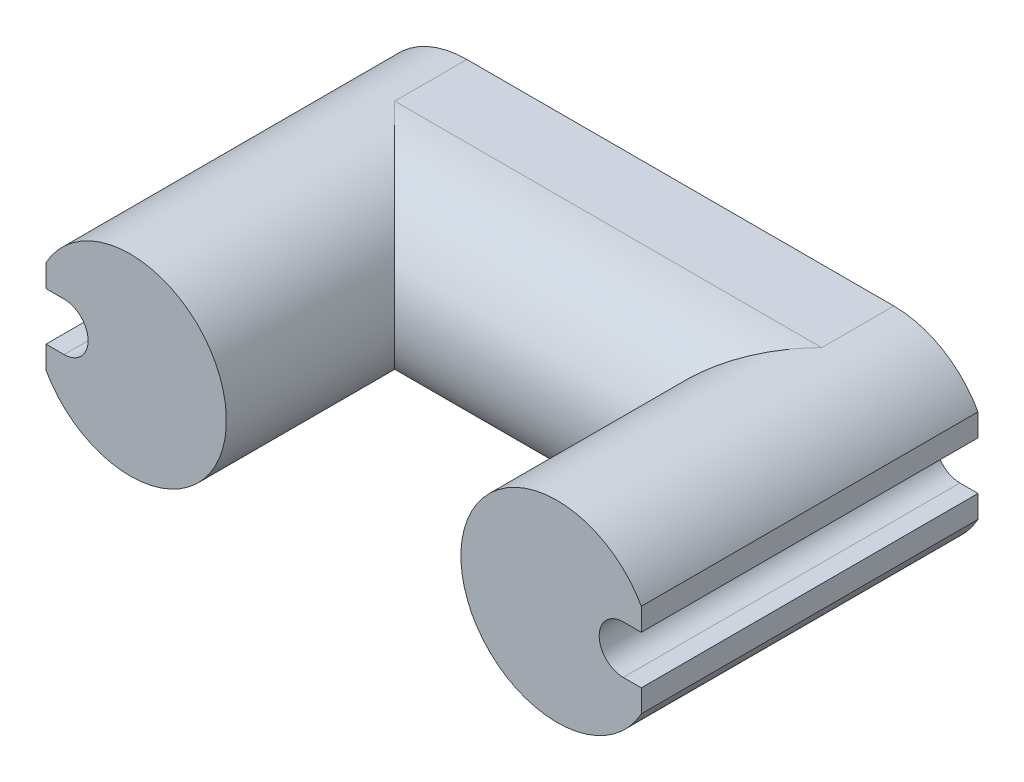
ISO-10303-21;
HEADER;
FILE_DESCRIPTION(('STEP AP214'),'2;1');
FILE_NAME('part.step','',(''),(''),'','','');
FILE_SCHEMA(('AUTOMOTIVE_DESIGN { 1 0 10303 214 1 1 1 1 }'));
ENDSEC;
DATA;
#1=APPLICATION_CONTEXT('core data for automotive mechanical design processes');
#2=APPLICATION_PROTOCOL_DEFINITION('international standard','automotive_design',2000,#1);
#3=PRODUCT_CONTEXT('',#1,'mechanical');
#4=PRODUCT('Part','Part','',(#3));
#5=PRODUCT_RELATED_PRODUCT_CATEGORY('part','',(#4));
#6=PRODUCT_DEFINITION_FORMATION('','',#4);
#7=PRODUCT_DEFINITION_CONTEXT('part definition',#1,'design');
#8=PRODUCT_DEFINITION('design','',#6,#7);
#9=PRODUCT_DEFINITION_SHAPE('','',#8);
#10=(LENGTH_UNIT() NAMED_UNIT(*) SI_UNIT(.MILLI.,.METRE.));
#11=(NAMED_UNIT(*) PLANE_ANGLE_UNIT() SI_UNIT($,.RADIAN.));
#12=(NAMED_UNIT(*) SI_UNIT($,.STERADIAN.) SOLID_ANGLE_UNIT());
#13=UNCERTAINTY_MEASURE_WITH_UNIT(LENGTH_MEASURE(1.E-05),#10,'distance_accuracy_value','');
#14=(GEOMETRIC_REPRESENTATION_CONTEXT(3) GLOBAL_UNCERTAINTY_ASSIGNED_CONTEXT((#13)) GLOBAL_UNIT_ASSIGNED_CONTEXT((#10,
#11,#12)) REPRESENTATION_CONTEXT('',''));
#15=CARTESIAN_POINT('',(0.,0.,0.));
#16=DIRECTION('',(0.,0.,1.));
#17=DIRECTION('',(1.,0.,0.));
#18=AXIS2_PLACEMENT_3D('',#15,#16,#17);
#19=CARTESIAN_POINT('',(-17.75,0.,-28.));
#20=DIRECTION('',(0.,0.,1.));
#21=DIRECTION('',(1.,0.,0.));
#22=AXIS2_PLACEMENT_3D('',#19,#20,#21);
#23=CYLINDRICAL_SURFACE('',#22,8.);
#24=CARTESIAN_POINT('',(-17.75,0.,-22.));
#25=DIRECTION('',(0.707106781186547,0.,-0.707106781186547));
#26=DIRECTION('',(0.707106781186547,0.,0.707106781186547));
#27=AXIS2_PLACEMENT_3D('',#24,#25,#26);
#28=ELLIPSE('',#27,11.3137084989848,8.);
#29=CARTESIAN_POINT('',(-17.75,-8.,-22.));
#30=VERTEX_POINT('',#29);
#31=CARTESIAN_POINT('',(-17.75,8.,-22.));
#32=VERTEX_POINT('',#31);
#33=EDGE_CURVE('E50',#30,#32,#28,.F.);
#34=ORIENTED_EDGE('',*,*,#33,.T.);
#35=DIRECTION('',(0.,0.,1.));
#36=VECTOR('',#35,1.);
#37=CARTESIAN_POINT('',(-17.75,8.,-28.));
#38=LINE('',#37,#36);
#39=CARTESIAN_POINT('',(-17.75,8.00000000000001,-28.));
#40=VERTEX_POINT('',#39);
#41=EDGE_CURVE('E209',#40,#32,#38,.T.);
#42=ORIENTED_EDGE('',*,*,#41,.F.);
#43=CARTESIAN_POINT('',(-17.75,0.,-28.));
#44=DIRECTION('',(0.,0.,1.));
#45=DIRECTION('',(1.,0.,0.));
#46=AXIS2_PLACEMENT_3D('',#43,#44,#45);
#47=CIRCLE('',#46,8.);
#48=CARTESIAN_POINT('',(-24.75,3.87298334620742,-28.));
#49=VERTEX_POINT('',#48);
#50=EDGE_CURVE('E241',#40,#49,#47,.T.);
#51=ORIENTED_EDGE('',*,*,#50,.T.);
#52=DIRECTION('',(0.,0.,1.));
#53=VECTOR('',#52,1.);
#54=CARTESIAN_POINT('',(-24.75,3.87298334620742,-28.));
#55=LINE('',#54,#53);
#56=CARTESIAN_POINT('',(-24.75,3.87298334620742,0.));
#57=VERTEX_POINT('',#56);
#58=EDGE_CURVE('E267',#49,#57,#55,.T.);
#59=ORIENTED_EDGE('',*,*,#58,.T.);
#60=CARTESIAN_POINT('',(-17.75,0.,0.));
#61=DIRECTION('',(0.,0.,1.));
#62=DIRECTION('',(1.,0.,0.));
#63=AXIS2_PLACEMENT_3D('',#60,#61,#62);
#64=CIRCLE('',#63,8.);
#65=CARTESIAN_POINT('',(-24.75,-3.87298334620742,0.));
#66=VERTEX_POINT('',#65);
#67=EDGE_CURVE('E258',#66,#57,#64,.T.);
#68=ORIENTED_EDGE('',*,*,#67,.F.);
#69=DIRECTION('',(0.,0.,1.));
#70=VECTOR('',#69,1.);
#71=CARTESIAN_POINT('',(-24.75,-3.87298334620742,-28.));
#72=LINE('',#71,#70);
#73=CARTESIAN_POINT('',(-24.75,-3.87298334620742,-28.));
#74=VERTEX_POINT('',#73);
#75=EDGE_CURVE('E269',#74,#66,#72,.T.);
#76=ORIENTED_EDGE('',*,*,#75,.F.);
#77=CARTESIAN_POINT('',(-17.75,-8.,-28.));
#78=VERTEX_POINT('',#77);
#79=EDGE_CURVE('E242',#74,#78,#47,.T.);
#80=ORIENTED_EDGE('',*,*,#79,.T.);
#81=DIRECTION('',(0.,0.,1.));
#82=VECTOR('',#81,1.);
#83=CARTESIAN_POINT('',(-17.75,-8.,-28.));
#84=LINE('',#83,#82);
#85=EDGE_CURVE('E55',#78,#30,#84,.T.);
#86=ORIENTED_EDGE('',*,*,#85,.T.);
#87=EDGE_LOOP('',(#34,#42,#51,#59,#68,#76,#80,#86));
#88=FACE_BOUND('',#87,.T.);
#89=ADVANCED_FACE('F33',(#88),#23,.T.);
#90=CARTESIAN_POINT('',(-23.25,0.,-28.));
#91=DIRECTION('',(0.,0.,1.));
#92=DIRECTION('',(1.,0.,0.));
#93=AXIS2_PLACEMENT_3D('',#90,#91,#92);
#94=CYLINDRICAL_SURFACE('',#93,2.);
#95=CARTESIAN_POINT('',(-23.25,0.,0.));
#96=DIRECTION('',(0.,0.,-1.));
#97=DIRECTION('',(1.,0.,0.));
#98=AXIS2_PLACEMENT_3D('',#95,#96,#97);
#99=CIRCLE('',#98,2.);
#100=CARTESIAN_POINT('',(-23.25,2.,0.));
#101=VERTEX_POINT('',#100);
#102=CARTESIAN_POINT('',(-23.25,-2.,0.));
#103=VERTEX_POINT('',#102);
#104=EDGE_CURVE('E228',#101,#103,#99,.T.);
#105=ORIENTED_EDGE('',*,*,#104,.F.);
#106=DIRECTION('',(0.,0.,1.));
#107=VECTOR('',#106,1.);
#108=CARTESIAN_POINT('',(-23.25,2.,-28.));
#109=LINE('',#108,#107);
#110=CARTESIAN_POINT('',(-23.25,2.,-28.));
#111=VERTEX_POINT('',#110);
#112=EDGE_CURVE('E11',#111,#101,#109,.T.);
#113=ORIENTED_EDGE('',*,*,#112,.F.);
#114=CARTESIAN_POINT('',(-23.25,0.,-28.));
#115=DIRECTION('',(0.,0.,-1.));
#116=DIRECTION('',(1.,0.,0.));
#117=AXIS2_PLACEMENT_3D('',#114,#115,#116);
#118=CIRCLE('',#117,2.);
#119=CARTESIAN_POINT('',(-23.25,-2.,-28.));
#120=VERTEX_POINT('',#119);
#121=EDGE_CURVE('E231',#111,#120,#118,.T.);
#122=ORIENTED_EDGE('',*,*,#121,.T.);
#123=DIRECTION('',(0.,0.,1.));
#124=VECTOR('',#123,1.);
#125=CARTESIAN_POINT('',(-23.25,-2.,-28.));
#126=LINE('',#125,#124);
#127=EDGE_CURVE('E37',#120,#103,#126,.T.);
#128=ORIENTED_EDGE('',*,*,#127,.T.);
#129=EDGE_LOOP('',(#105,#113,#122,#128));
#130=FACE_BOUND('',#129,.T.);
#131=ADVANCED_FACE('F35',(#130),#94,.F.);
#132=CARTESIAN_POINT('',(-23.25,2.,-28.));
#133=DIRECTION('',(0.,-1.,0.));
#134=DIRECTION('',(0.,0.,-1.));
#135=AXIS2_PLACEMENT_3D('',#132,#133,#134);
#136=PLANE('',#135);
#137=DIRECTION('',(1.,0.,0.));
#138=VECTOR('',#137,1.);
#139=CARTESIAN_POINT('',(-23.25,2.,0.));
#140=LINE('',#139,#138);
#141=CARTESIAN_POINT('',(-24.75,2.,0.));
#142=VERTEX_POINT('',#141);
#143=EDGE_CURVE('E235',#142,#101,#140,.T.);
#144=ORIENTED_EDGE('',*,*,#143,.F.);
#145=DIRECTION('',(0.,0.,1.));
#146=VECTOR('',#145,1.);
#147=CARTESIAN_POINT('',(-24.75,2.,-28.));
#148=LINE('',#147,#146);
#149=CARTESIAN_POINT('',(-24.75,2.,-28.));
#150=VERTEX_POINT('',#149);
#151=EDGE_CURVE('E42',#150,#142,#148,.T.);
#152=ORIENTED_EDGE('',*,*,#151,.F.);
#153=DIRECTION('',(1.,0.,0.));
#154=VECTOR('',#153,1.);
#155=CARTESIAN_POINT('',(-23.25,2.,-28.));
#156=LINE('',#155,#154);
#157=EDGE_CURVE('E247',#150,#111,#156,.T.);
#158=ORIENTED_EDGE('',*,*,#157,.T.);
#159=ORIENTED_EDGE('',*,*,#112,.T.);
#160=EDGE_LOOP('',(#144,#152,#158,#159));
#161=FACE_BOUND('',#160,.T.);
#162=ADVANCED_FACE('F283',(#161),#136,.T.);
#163=CARTESIAN_POINT('',(-24.75,2.,-28.));
#164=DIRECTION('',(-1.,0.,0.));
#165=DIRECTION('',(0.,-1.,0.));
#166=AXIS2_PLACEMENT_3D('',#163,#164,#165);
#167=PLANE('',#166);
#168=DIRECTION('',(0.,-1.,0.));
#169=VECTOR('',#168,1.);
#170=CARTESIAN_POINT('',(-24.75,2.,0.));
#171=LINE('',#170,#169);
#172=EDGE_CURVE('E261',#57,#142,#171,.T.);
#173=ORIENTED_EDGE('',*,*,#172,.F.);
#174=ORIENTED_EDGE('',*,*,#58,.F.);
#175=DIRECTION('',(0.,-1.,0.));
#176=VECTOR('',#175,1.);
#177=CARTESIAN_POINT('',(-24.75,2.,-28.));
#178=LINE('',#177,#176);
#179=EDGE_CURVE('E244',#49,#150,#178,.T.);
#180=ORIENTED_EDGE('',*,*,#179,.T.);
#181=ORIENTED_EDGE('',*,*,#151,.T.);
#182=EDGE_LOOP('',(#173,#174,#180,#181));
#183=FACE_BOUND('',#182,.T.);
#184=ADVANCED_FACE('F294',(#183),#167,.T.);
#185=CARTESIAN_POINT('',(-24.75,-3.87298334620742,-28.));
#186=DIRECTION('',(-1.,0.,0.));
#187=DIRECTION('',(0.,-1.,0.));
#188=AXIS2_PLACEMENT_3D('',#185,#186,#187);
#189=PLANE('',#188);
#190=DIRECTION('',(0.,-1.,0.));
#191=VECTOR('',#190,1.);
#192=CARTESIAN_POINT('',(-24.75,-3.87298334620742,0.));
#193=LINE('',#192,#191);
#194=CARTESIAN_POINT('',(-24.75,-2.,0.));
#195=VERTEX_POINT('',#194);
#196=EDGE_CURVE('E255',#195,#66,#193,.T.);
#197=ORIENTED_EDGE('',*,*,#196,.F.);
#198=DIRECTION('',(0.,0.,1.));
#199=VECTOR('',#198,1.);
#200=CARTESIAN_POINT('',(-24.75,-2.,-28.));
#201=LINE('',#200,#199);
#202=CARTESIAN_POINT('',(-24.75,-2.,-28.));
#203=VERTEX_POINT('',#202);
#204=EDGE_CURVE('E270',#203,#195,#201,.T.);
#205=ORIENTED_EDGE('',*,*,#204,.F.);
#206=DIRECTION('',(0.,-1.,0.));
#207=VECTOR('',#206,1.);
#208=CARTESIAN_POINT('',(-24.75,-3.87298334620742,-28.));
#209=LINE('',#208,#207);
#210=EDGE_CURVE('E238',#203,#74,#209,.T.);
#211=ORIENTED_EDGE('',*,*,#210,.T.);
#212=ORIENTED_EDGE('',*,*,#75,.T.);
#213=EDGE_LOOP('',(#197,#205,#211,#212));
#214=FACE_BOUND('',#213,.T.);
#215=ADVANCED_FACE('F290',(#214),#189,.T.);
#216=CARTESIAN_POINT('',(-23.25,-2.,-28.));
#217=DIRECTION('',(0.,1.,0.));
#218=DIRECTION('',(0.,0.,1.));
#219=AXIS2_PLACEMENT_3D('',#216,#217,#218);
#220=PLANE('',#219);
#221=DIRECTION('',(-1.,0.,0.));
#222=VECTOR('',#221,1.);
#223=CARTESIAN_POINT('',(-23.25,-2.,0.));
#224=LINE('',#223,#222);
#225=EDGE_CURVE('E252',#103,#195,#224,.T.);
#226=ORIENTED_EDGE('',*,*,#225,.F.);
#227=ORIENTED_EDGE('',*,*,#127,.F.);
#228=DIRECTION('',(-1.,0.,0.));
#229=VECTOR('',#228,1.);
#230=CARTESIAN_POINT('',(-23.25,-2.,-28.));
#231=LINE('',#230,#229);
#232=EDGE_CURVE('E234',#120,#203,#231,.T.);
#233=ORIENTED_EDGE('',*,*,#232,.T.);
#234=ORIENTED_EDGE('',*,*,#204,.T.);
#235=EDGE_LOOP('',(#226,#227,#233,#234));
#236=FACE_BOUND('',#235,.T.);
#237=ADVANCED_FACE('F277',(#236),#220,.T.);
#238=CARTESIAN_POINT('',(-23.25,0.,-28.));
#239=DIRECTION('',(0.,0.,1.));
#240=DIRECTION('',(1.,0.,0.));
#241=AXIS2_PLACEMENT_3D('',#238,#239,#240);
#242=PLANE('',#241);
#243=ORIENTED_EDGE('',*,*,#121,.F.);
#244=ORIENTED_EDGE('',*,*,#157,.F.);
#245=ORIENTED_EDGE('',*,*,#179,.F.);
#246=ORIENTED_EDGE('',*,*,#50,.F.);
#247=DIRECTION('',(1.,0.,0.));
#248=VECTOR('',#247,1.);
#249=CARTESIAN_POINT('',(-24.751,8.00000000000001,-28.));
#250=LINE('',#249,#248);
#251=CARTESIAN_POINT('',(17.75,8.00000000000001,-28.));
#252=VERTEX_POINT('',#251);
#253=EDGE_CURVE('E218',#40,#252,#250,.T.);
#254=ORIENTED_EDGE('',*,*,#253,.T.);
#255=CARTESIAN_POINT('',(17.75,0.,-28.));
#256=DIRECTION('',(0.,0.,1.));
#257=DIRECTION('',(-1.,0.,0.));
#258=AXIS2_PLACEMENT_3D('',#255,#256,#257);
#259=CIRCLE('',#258,8.);
#260=CARTESIAN_POINT('',(24.75,3.87298334620743,-28.));
#261=VERTEX_POINT('',#260);
#262=EDGE_CURVE('E181',#261,#252,#259,.T.);
#263=ORIENTED_EDGE('',*,*,#262,.F.);
#264=DIRECTION('',(0.,1.,0.));
#265=VECTOR('',#264,1.);
#266=CARTESIAN_POINT('',(24.75,2.00000000000001,-28.));
#267=LINE('',#266,#265);
#268=CARTESIAN_POINT('',(24.75,2.00000000000001,-28.));
#269=VERTEX_POINT('',#268);
#270=EDGE_CURVE('E169',#269,#261,#267,.T.);
#271=ORIENTED_EDGE('',*,*,#270,.F.);
#272=DIRECTION('',(1.,0.,0.));
#273=VECTOR('',#272,1.);
#274=CARTESIAN_POINT('',(23.25,2.00000000000001,-28.));
#275=LINE('',#274,#273);
#276=CARTESIAN_POINT('',(23.25,2.00000000000001,-28.));
#277=VERTEX_POINT('',#276);
#278=EDGE_CURVE('E149',#277,#269,#275,.T.);
#279=ORIENTED_EDGE('',*,*,#278,.F.);
#280=CARTESIAN_POINT('',(23.25,0.,-28.));
#281=DIRECTION('',(0.,0.,-1.));
#282=DIRECTION('',(-1.,0.,0.));
#283=AXIS2_PLACEMENT_3D('',#280,#281,#282);
#284=CIRCLE('',#283,2.00000000000001);
#285=CARTESIAN_POINT('',(23.25,-2.00000000000001,-28.));
#286=VERTEX_POINT('',#285);
#287=EDGE_CURVE('E165',#286,#277,#284,.T.);
#288=ORIENTED_EDGE('',*,*,#287,.F.);
#289=DIRECTION('',(-1.,0.,0.));
#290=VECTOR('',#289,1.);
#291=CARTESIAN_POINT('',(23.25,-2.00000000000001,-28.));
#292=LINE('',#291,#290);
#293=CARTESIAN_POINT('',(24.75,-2.00000000000001,-28.));
#294=VERTEX_POINT('',#293);
#295=EDGE_CURVE('E157',#294,#286,#292,.T.);
#296=ORIENTED_EDGE('',*,*,#295,.F.);
#297=DIRECTION('',(0.,1.,0.));
#298=VECTOR('',#297,1.);
#299=CARTESIAN_POINT('',(24.75,-3.87298334620742,-28.));
#300=LINE('',#299,#298);
#301=CARTESIAN_POINT('',(24.75,-3.87298334620742,-28.));
#302=VERTEX_POINT('',#301);
#303=EDGE_CURVE('E183',#302,#294,#300,.T.);
#304=ORIENTED_EDGE('',*,*,#303,.F.);
#305=CARTESIAN_POINT('',(17.75,-8.,-28.));
#306=VERTEX_POINT('',#305);
#307=EDGE_CURVE('E180',#306,#302,#259,.T.);
#308=ORIENTED_EDGE('',*,*,#307,.F.);
#309=DIRECTION('',(1.,0.,0.));
#310=VECTOR('',#309,1.);
#311=CARTESIAN_POINT('',(-24.751,-8.,-28.));
#312=LINE('',#311,#310);
#313=EDGE_CURVE('E224',#78,#306,#312,.T.);
#314=ORIENTED_EDGE('',*,*,#313,.F.);
#315=ORIENTED_EDGE('',*,*,#79,.F.);
#316=ORIENTED_EDGE('',*,*,#210,.F.);
#317=ORIENTED_EDGE('',*,*,#232,.F.);
#318=EDGE_LOOP('',(#243,#244,#245,#246,#254,#263,#271,#279,#288,#296,#304,#308,#314,#315,#316,#317));
#319=FACE_BOUND('',#318,.T.);
#320=ADVANCED_FACE('F163',(#319),#242,.F.);
#321=CARTESIAN_POINT('',(-23.25,0.,0.));
#322=DIRECTION('',(0.,0.,1.));
#323=DIRECTION('',(1.,0.,0.));
#324=AXIS2_PLACEMENT_3D('',#321,#322,#323);
#325=PLANE('',#324);
#326=ORIENTED_EDGE('',*,*,#104,.T.);
#327=ORIENTED_EDGE('',*,*,#225,.T.);
#328=ORIENTED_EDGE('',*,*,#196,.T.);
#329=ORIENTED_EDGE('',*,*,#67,.T.);
#330=ORIENTED_EDGE('',*,*,#172,.T.);
#331=ORIENTED_EDGE('',*,*,#143,.T.);
#332=EDGE_LOOP('',(#326,#327,#328,#329,#330,#331));
#333=FACE_BOUND('',#332,.T.);
#334=ADVANCED_FACE('F279',(#333),#325,.T.);
#335=CARTESIAN_POINT('',(-24.751,8.00000000000001,-28.));
#336=DIRECTION('',(0.,1.,0.));
#337=DIRECTION('',(0.,0.,1.));
#338=AXIS2_PLACEMENT_3D('',#335,#336,#337);
#339=PLANE('',#338);
#340=ORIENTED_EDGE('',*,*,#253,.F.);
#341=ORIENTED_EDGE('',*,*,#41,.T.);
#342=DIRECTION('',(1.,0.,0.));
#343=VECTOR('',#342,1.);
#344=CARTESIAN_POINT('',(-24.751,8.,-22.));
#345=LINE('',#344,#343);
#346=CARTESIAN_POINT('',(17.75,8.,-22.));
#347=VERTEX_POINT('',#346);
#348=EDGE_CURVE('E215',#32,#347,#345,.T.);
#349=ORIENTED_EDGE('',*,*,#348,.T.);
#350=DIRECTION('',(0.,0.,1.));
#351=VECTOR('',#350,1.);
#352=CARTESIAN_POINT('',(17.75,8.00000000000001,-28.));
#353=LINE('',#352,#351);
#354=EDGE_CURVE('E207',#252,#347,#353,.T.);
#355=ORIENTED_EDGE('',*,*,#354,.F.);
#356=EDGE_LOOP('',(#340,#341,#349,#355));
#357=FACE_BOUND('',#356,.T.);
#358=ADVANCED_FACE('F299',(#357),#339,.T.);
#359=CARTESIAN_POINT('',(-24.751,0.,-22.));
#360=DIRECTION('',(1.,0.,0.));
#361=DIRECTION('',(0.,0.,-1.));
#362=AXIS2_PLACEMENT_3D('',#359,#360,#361);
#363=CYLINDRICAL_SURFACE('',#362,8.);
#364=ORIENTED_EDGE('',*,*,#33,.F.);
#365=DIRECTION('',(1.,0.,0.));
#366=VECTOR('',#365,1.);
#367=CARTESIAN_POINT('',(-24.751,-8.,-22.0000000000001));
#368=LINE('',#367,#366);
#369=CARTESIAN_POINT('',(17.75,-8.,-22.));
#370=VERTEX_POINT('',#369);
#371=EDGE_CURVE('E221',#30,#370,#368,.T.);
#372=ORIENTED_EDGE('',*,*,#371,.T.);
#373=CARTESIAN_POINT('',(17.75,0.,-22.));
#374=DIRECTION('',(-0.707106781186547,0.,-0.707106781186547));
#375=DIRECTION('',(-0.707106781186547,0.,0.707106781186547));
#376=AXIS2_PLACEMENT_3D('',#373,#374,#375);
#377=ELLIPSE('',#376,11.3137084989848,8.);
#378=EDGE_CURVE('E199',#370,#347,#377,.T.);
#379=ORIENTED_EDGE('',*,*,#378,.T.);
#380=ORIENTED_EDGE('',*,*,#348,.F.);
#381=EDGE_LOOP('',(#364,#372,#379,#380));
#382=FACE_BOUND('',#381,.T.);
#383=ADVANCED_FACE('F321',(#382),#363,.T.);
#384=CARTESIAN_POINT('',(-24.751,-8.,-28.));
#385=DIRECTION('',(0.,-1.,0.));
#386=DIRECTION('',(0.,0.,-1.));
#387=AXIS2_PLACEMENT_3D('',#384,#385,#386);
#388=PLANE('',#387);
#389=ORIENTED_EDGE('',*,*,#85,.F.);
#390=ORIENTED_EDGE('',*,*,#313,.T.);
#391=DIRECTION('',(0.,0.,1.));
#392=VECTOR('',#391,1.);
#393=CARTESIAN_POINT('',(17.75,-8.,-28.));
#394=LINE('',#393,#392);
#395=EDGE_CURVE('E210',#306,#370,#394,.T.);
#396=ORIENTED_EDGE('',*,*,#395,.T.);
#397=ORIENTED_EDGE('',*,*,#371,.F.);
#398=EDGE_LOOP('',(#389,#390,#396,#397));
#399=FACE_BOUND('',#398,.T.);
#400=ADVANCED_FACE('F319',(#399),#388,.T.);
#401=CARTESIAN_POINT('',(23.25,0.,-28.));
#402=DIRECTION('',(0.,0.,1.));
#403=DIRECTION('',(1.,0.,0.));
#404=AXIS2_PLACEMENT_3D('',#401,#402,#403);
#405=CYLINDRICAL_SURFACE('',#404,2.00000000000001);
#406=CARTESIAN_POINT('',(23.25,0.,0.));
#407=DIRECTION('',(0.,0.,-1.));
#408=DIRECTION('',(-1.,0.,0.));
#409=AXIS2_PLACEMENT_3D('',#406,#407,#408);
#410=CIRCLE('',#409,2.00000000000001);
#411=CARTESIAN_POINT('',(23.25,-2.00000000000001,0.));
#412=VERTEX_POINT('',#411);
#413=CARTESIAN_POINT('',(23.25,2.00000000000001,0.));
#414=VERTEX_POINT('',#413);
#415=EDGE_CURVE('E187',#412,#414,#410,.T.);
#416=ORIENTED_EDGE('',*,*,#415,.F.);
#417=DIRECTION('',(0.,0.,1.));
#418=VECTOR('',#417,1.);
#419=CARTESIAN_POINT('',(23.25,-2.00000000000001,-28.));
#420=LINE('',#419,#418);
#421=EDGE_CURVE('E172',#286,#412,#420,.T.);
#422=ORIENTED_EDGE('',*,*,#421,.F.);
#423=ORIENTED_EDGE('',*,*,#287,.T.);
#424=DIRECTION('',(0.,0.,1.));
#425=VECTOR('',#424,1.);
#426=CARTESIAN_POINT('',(23.25,2.00000000000001,-28.));
#427=LINE('',#426,#425);
#428=EDGE_CURVE('E146',#277,#414,#427,.T.);
#429=ORIENTED_EDGE('',*,*,#428,.T.);
#430=EDGE_LOOP('',(#416,#422,#423,#429));
#431=FACE_BOUND('',#430,.T.);
#432=ADVANCED_FACE('F171',(#431),#405,.F.);
#433=CARTESIAN_POINT('',(23.25,-2.00000000000001,-28.));
#434=DIRECTION('',(0.,1.,0.));
#435=DIRECTION('',(-1.,0.,0.));
#436=AXIS2_PLACEMENT_3D('',#433,#434,#435);
#437=PLANE('',#436);
#438=DIRECTION('',(-1.,0.,0.));
#439=VECTOR('',#438,1.);
#440=CARTESIAN_POINT('',(23.25,-2.00000000000001,0.));
#441=LINE('',#440,#439);
#442=CARTESIAN_POINT('',(24.75,-2.00000000000001,0.));
#443=VERTEX_POINT('',#442);
#444=EDGE_CURVE('E173',#443,#412,#441,.T.);
#445=ORIENTED_EDGE('',*,*,#444,.F.);
#446=DIRECTION('',(0.,0.,1.));
#447=VECTOR('',#446,1.);
#448=CARTESIAN_POINT('',(24.75,-2.00000000000001,-28.));
#449=LINE('',#448,#447);
#450=EDGE_CURVE('E200',#294,#443,#449,.T.);
#451=ORIENTED_EDGE('',*,*,#450,.F.);
#452=ORIENTED_EDGE('',*,*,#295,.T.);
#453=ORIENTED_EDGE('',*,*,#421,.T.);
#454=EDGE_LOOP('',(#445,#451,#452,#453));
#455=FACE_BOUND('',#454,.T.);
#456=ADVANCED_FACE('F312',(#455),#437,.T.);
#457=CARTESIAN_POINT('',(24.75,-3.87298334620742,-28.));
#458=DIRECTION('',(1.,0.,0.));
#459=DIRECTION('',(0.,1.,0.));
#460=AXIS2_PLACEMENT_3D('',#457,#458,#459);
#461=PLANE('',#460);
#462=DIRECTION('',(0.,1.,0.));
#463=VECTOR('',#462,1.);
#464=CARTESIAN_POINT('',(24.75,-3.87298334620742,0.));
#465=LINE('',#464,#463);
#466=CARTESIAN_POINT('',(24.75,-3.87298334620742,0.));
#467=VERTEX_POINT('',#466);
#468=EDGE_CURVE('E176',#467,#443,#465,.T.);
#469=ORIENTED_EDGE('',*,*,#468,.F.);
#470=DIRECTION('',(0.,0.,1.));
#471=VECTOR('',#470,1.);
#472=CARTESIAN_POINT('',(24.75,-3.87298334620742,-28.));
#473=LINE('',#472,#471);
#474=EDGE_CURVE('E202',#302,#467,#473,.T.);
#475=ORIENTED_EDGE('',*,*,#474,.F.);
#476=ORIENTED_EDGE('',*,*,#303,.T.);
#477=ORIENTED_EDGE('',*,*,#450,.T.);
#478=EDGE_LOOP('',(#469,#475,#476,#477));
#479=FACE_BOUND('',#478,.T.);
#480=ADVANCED_FACE('F316',(#479),#461,.T.);
#481=CARTESIAN_POINT('',(17.75,0.,-28.));
#482=DIRECTION('',(0.,0.,1.));
#483=DIRECTION('',(1.,0.,0.));
#484=AXIS2_PLACEMENT_3D('',#481,#482,#483);
#485=CYLINDRICAL_SURFACE('',#484,8.);
#486=ORIENTED_EDGE('',*,*,#262,.T.);
#487=ORIENTED_EDGE('',*,*,#354,.T.);
#488=ORIENTED_EDGE('',*,*,#378,.F.);
#489=ORIENTED_EDGE('',*,*,#395,.F.);
#490=ORIENTED_EDGE('',*,*,#307,.T.);
#491=ORIENTED_EDGE('',*,*,#474,.T.);
#492=CARTESIAN_POINT('',(17.75,0.,0.));
#493=DIRECTION('',(0.,0.,1.));
#494=DIRECTION('',(-1.,0.,0.));
#495=AXIS2_PLACEMENT_3D('',#492,#493,#494);
#496=CIRCLE('',#495,8.);
#497=CARTESIAN_POINT('',(24.75,3.87298334620743,0.));
#498=VERTEX_POINT('',#497);
#499=EDGE_CURVE('E193',#498,#467,#496,.T.);
#500=ORIENTED_EDGE('',*,*,#499,.F.);
#501=DIRECTION('',(0.,0.,1.));
#502=VECTOR('',#501,1.);
#503=CARTESIAN_POINT('',(24.75,3.87298334620743,-28.));
#504=LINE('',#503,#502);
#505=EDGE_CURVE('E204',#261,#498,#504,.T.);
#506=ORIENTED_EDGE('',*,*,#505,.F.);
#507=EDGE_LOOP('',(#486,#487,#488,#489,#490,#491,#500,#506));
#508=FACE_BOUND('',#507,.T.);
#509=ADVANCED_FACE('F301',(#508),#485,.T.);
#510=CARTESIAN_POINT('',(24.75,2.00000000000001,-28.));
#511=DIRECTION('',(1.,0.,0.));
#512=DIRECTION('',(0.,1.,0.));
#513=AXIS2_PLACEMENT_3D('',#510,#511,#512);
#514=PLANE('',#513);
#515=DIRECTION('',(0.,1.,0.));
#516=VECTOR('',#515,1.);
#517=CARTESIAN_POINT('',(24.75,2.00000000000001,0.));
#518=LINE('',#517,#516);
#519=CARTESIAN_POINT('',(24.75,2.00000000000001,0.));
#520=VERTEX_POINT('',#519);
#521=EDGE_CURVE('E190',#520,#498,#518,.T.);
#522=ORIENTED_EDGE('',*,*,#521,.F.);
#523=DIRECTION('',(0.,0.,1.));
#524=VECTOR('',#523,1.);
#525=CARTESIAN_POINT('',(24.75,2.00000000000001,-28.));
#526=LINE('',#525,#524);
#527=EDGE_CURVE('E156',#269,#520,#526,.T.);
#528=ORIENTED_EDGE('',*,*,#527,.F.);
#529=ORIENTED_EDGE('',*,*,#270,.T.);
#530=ORIENTED_EDGE('',*,*,#505,.T.);
#531=EDGE_LOOP('',(#522,#528,#529,#530));
#532=FACE_BOUND('',#531,.T.);
#533=ADVANCED_FACE('F306',(#532),#514,.T.);
#534=CARTESIAN_POINT('',(23.25,2.00000000000001,-28.));
#535=DIRECTION('',(0.,-1.,0.));
#536=DIRECTION('',(1.,0.,0.));
#537=AXIS2_PLACEMENT_3D('',#534,#535,#536);
#538=PLANE('',#537);
#539=DIRECTION('',(1.,0.,0.));
#540=VECTOR('',#539,1.);
#541=CARTESIAN_POINT('',(23.25,2.00000000000001,0.));
#542=LINE('',#541,#540);
#543=EDGE_CURVE('E151',#414,#520,#542,.T.);
#544=ORIENTED_EDGE('',*,*,#543,.F.);
#545=ORIENTED_EDGE('',*,*,#428,.F.);
#546=ORIENTED_EDGE('',*,*,#278,.T.);
#547=ORIENTED_EDGE('',*,*,#527,.T.);
#548=EDGE_LOOP('',(#544,#545,#546,#547));
#549=FACE_BOUND('',#548,.T.);
#550=ADVANCED_FACE('F148',(#549),#538,.T.);
#551=CARTESIAN_POINT('',(23.25,0.,0.));
#552=DIRECTION('',(0.,0.,-1.));
#553=DIRECTION('',(-1.,0.,0.));
#554=AXIS2_PLACEMENT_3D('',#551,#552,#553);
#555=PLANE('',#554);
#556=ORIENTED_EDGE('',*,*,#415,.T.);
#557=ORIENTED_EDGE('',*,*,#543,.T.);
#558=ORIENTED_EDGE('',*,*,#521,.T.);
#559=ORIENTED_EDGE('',*,*,#499,.T.);
#560=ORIENTED_EDGE('',*,*,#468,.T.);
#561=ORIENTED_EDGE('',*,*,#444,.T.);
#562=EDGE_LOOP('',(#556,#557,#558,#559,#560,#561));
#563=FACE_BOUND('',#562,.T.);
#564=ADVANCED_FACE('F308',(#563),#555,.F.);
#565=CLOSED_SHELL('',(#89,#131,#162,#184,#215,#237,#320,#334,#358,#383,#400,#432,#456,#480,#509,
#533,#550,#564));
#566=MANIFOLD_SOLID_BREP('B2',#565);
#567=ADVANCED_BREP_SHAPE_REPRESENTATION('',(#18,#566),#14);
#568=SHAPE_DEFINITION_REPRESENTATION(#9,#567);
ENDSEC;
END-ISO-10303-21;
